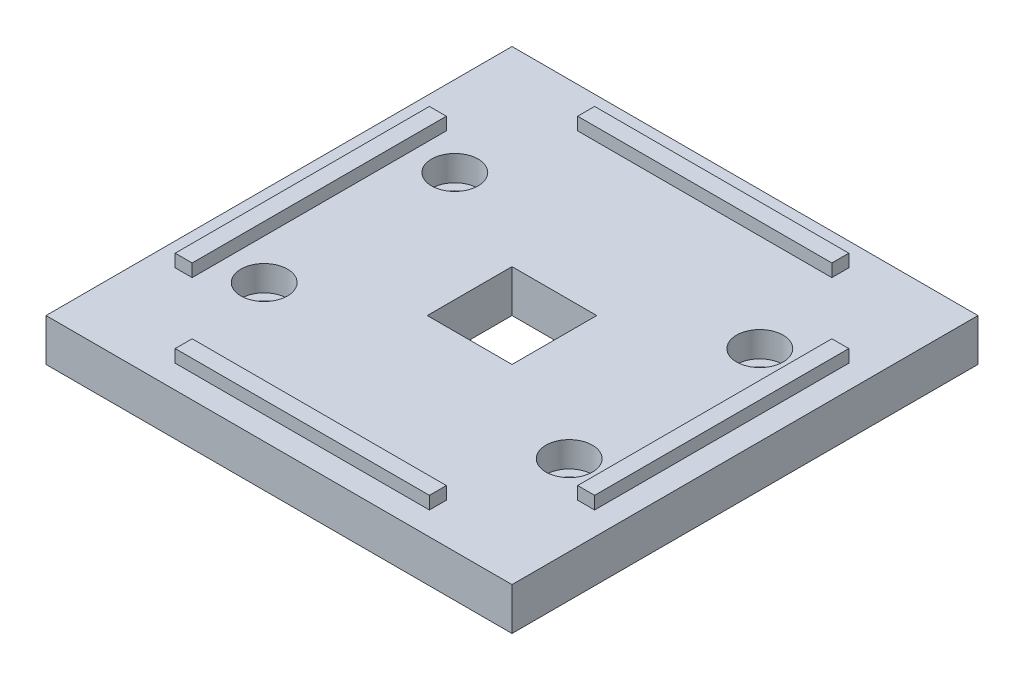
ISO-10303-21;
HEADER;
FILE_DESCRIPTION(('STEP AP214'),'2;1');
FILE_NAME('part.step','',(''),(''),'','','');
FILE_SCHEMA(('AUTOMOTIVE_DESIGN { 1 0 10303 214 1 1 1 1 }'));
ENDSEC;
DATA;
#1=APPLICATION_CONTEXT('core data for automotive mechanical design processes');
#2=APPLICATION_PROTOCOL_DEFINITION('international standard','automotive_design',2000,#1);
#3=PRODUCT_CONTEXT('',#1,'mechanical');
#4=PRODUCT('Part','Part','',(#3));
#5=PRODUCT_RELATED_PRODUCT_CATEGORY('part','',(#4));
#6=PRODUCT_DEFINITION_FORMATION('','',#4);
#7=PRODUCT_DEFINITION_CONTEXT('part definition',#1,'design');
#8=PRODUCT_DEFINITION('design','',#6,#7);
#9=PRODUCT_DEFINITION_SHAPE('','',#8);
#10=(LENGTH_UNIT() NAMED_UNIT(*) SI_UNIT(.MILLI.,.METRE.));
#11=(NAMED_UNIT(*) PLANE_ANGLE_UNIT() SI_UNIT($,.RADIAN.));
#12=(NAMED_UNIT(*) SI_UNIT($,.STERADIAN.) SOLID_ANGLE_UNIT());
#13=UNCERTAINTY_MEASURE_WITH_UNIT(LENGTH_MEASURE(1.E-05),#10,'distance_accuracy_value','');
#14=(GEOMETRIC_REPRESENTATION_CONTEXT(3) GLOBAL_UNCERTAINTY_ASSIGNED_CONTEXT((#13)) GLOBAL_UNIT_ASSIGNED_CONTEXT((#10,
#11,#12)) REPRESENTATION_CONTEXT('',''));
#15=CARTESIAN_POINT('',(0.,0.,0.));
#16=DIRECTION('',(0.,0.,1.));
#17=DIRECTION('',(1.,0.,0.));
#18=AXIS2_PLACEMENT_3D('',#15,#16,#17);
#19=CARTESIAN_POINT('',(9.5,0.,-38.75));
#20=DIRECTION('',(0.,1.,0.));
#21=DIRECTION('',(0.,0.,1.));
#22=AXIS2_PLACEMENT_3D('',#19,#20,#21);
#23=CYLINDRICAL_SURFACE('',#22,1.6);
#24=CARTESIAN_POINT('',(9.5,0.,-38.75));
#25=DIRECTION('',(0.,1.,0.));
#26=DIRECTION('',(0.,0.,1.));
#27=AXIS2_PLACEMENT_3D('',#24,#25,#26);
#28=CIRCLE('',#27,1.6);
#29=CARTESIAN_POINT('',(9.5,0.,-37.15));
#30=VERTEX_POINT('',#29);
#31=EDGE_CURVE('E230',#30,#30,#28,.T.);
#32=ORIENTED_EDGE('',*,*,#31,.F.);
#33=EDGE_LOOP('',(#32));
#34=FACE_BOUND('',#33,.T.);
#35=CARTESIAN_POINT('',(9.5,2.,-38.75));
#36=DIRECTION('',(0.,1.,0.));
#37=DIRECTION('',(0.,0.,1.));
#38=AXIS2_PLACEMENT_3D('',#35,#36,#37);
#39=CIRCLE('',#38,1.6);
#40=CARTESIAN_POINT('',(9.5,2.,-37.15));
#41=VERTEX_POINT('',#40);
#42=EDGE_CURVE('E37',#41,#41,#39,.F.);
#43=ORIENTED_EDGE('',*,*,#42,.F.);
#44=EDGE_LOOP('',(#43));
#45=FACE_BOUND('',#44,.T.);
#46=ADVANCED_FACE('F33',(#34,#45),#23,.F.);
#47=CARTESIAN_POINT('',(45.5,0.,-16.25));
#48=DIRECTION('',(0.,1.,0.));
#49=DIRECTION('',(0.,0.,1.));
#50=AXIS2_PLACEMENT_3D('',#47,#48,#49);
#51=CYLINDRICAL_SURFACE('',#50,1.6);
#52=CARTESIAN_POINT('',(45.5,0.,-16.25));
#53=DIRECTION('',(0.,1.,0.));
#54=DIRECTION('',(0.,0.,-1.));
#55=AXIS2_PLACEMENT_3D('',#52,#53,#54);
#56=CIRCLE('',#55,1.6);
#57=CARTESIAN_POINT('',(45.5,0.,-17.85));
#58=VERTEX_POINT('',#57);
#59=EDGE_CURVE('E221',#58,#58,#56,.T.);
#60=ORIENTED_EDGE('',*,*,#59,.F.);
#61=EDGE_LOOP('',(#60));
#62=FACE_BOUND('',#61,.T.);
#63=CARTESIAN_POINT('',(45.5,2.,-16.25));
#64=DIRECTION('',(0.,1.,0.));
#65=DIRECTION('',(0.,0.,1.));
#66=AXIS2_PLACEMENT_3D('',#63,#64,#65);
#67=CIRCLE('',#66,1.6);
#68=CARTESIAN_POINT('',(45.5,2.,-14.65));
#69=VERTEX_POINT('',#68);
#70=EDGE_CURVE('E403',#69,#69,#67,.F.);
#71=ORIENTED_EDGE('',*,*,#70,.F.);
#72=EDGE_LOOP('',(#71));
#73=FACE_BOUND('',#72,.T.);
#74=ADVANCED_FACE('F466',(#62,#73),#51,.F.);
#75=CARTESIAN_POINT('',(45.5,0.,-38.75));
#76=DIRECTION('',(0.,1.,0.));
#77=DIRECTION('',(0.,0.,1.));
#78=AXIS2_PLACEMENT_3D('',#75,#76,#77);
#79=CYLINDRICAL_SURFACE('',#78,1.6);
#80=CARTESIAN_POINT('',(45.5,0.,-38.75));
#81=DIRECTION('',(0.,1.,0.));
#82=DIRECTION('',(0.,0.,-1.));
#83=AXIS2_PLACEMENT_3D('',#80,#81,#82);
#84=CIRCLE('',#83,1.6);
#85=CARTESIAN_POINT('',(45.5,0.,-40.35));
#86=VERTEX_POINT('',#85);
#87=EDGE_CURVE('E226',#86,#86,#84,.T.);
#88=ORIENTED_EDGE('',*,*,#87,.F.);
#89=EDGE_LOOP('',(#88));
#90=FACE_BOUND('',#89,.T.);
#91=CARTESIAN_POINT('',(45.5,2.,-38.75));
#92=DIRECTION('',(0.,1.,0.));
#93=DIRECTION('',(0.,0.,1.));
#94=AXIS2_PLACEMENT_3D('',#91,#92,#93);
#95=CIRCLE('',#94,1.6);
#96=CARTESIAN_POINT('',(45.5,2.,-37.15));
#97=VERTEX_POINT('',#96);
#98=EDGE_CURVE('E400',#97,#97,#95,.F.);
#99=ORIENTED_EDGE('',*,*,#98,.F.);
#100=EDGE_LOOP('',(#99));
#101=FACE_BOUND('',#100,.T.);
#102=ADVANCED_FACE('F472',(#90,#101),#79,.F.);
#103=CARTESIAN_POINT('',(9.5,0.,-16.25));
#104=DIRECTION('',(0.,1.,0.));
#105=DIRECTION('',(0.,0.,1.));
#106=AXIS2_PLACEMENT_3D('',#103,#104,#105);
#107=CYLINDRICAL_SURFACE('',#106,1.6);
#108=CARTESIAN_POINT('',(9.5,0.,-16.25));
#109=DIRECTION('',(0.,1.,0.));
#110=DIRECTION('',(0.,0.,1.));
#111=AXIS2_PLACEMENT_3D('',#108,#109,#110);
#112=CIRCLE('',#111,1.6);
#113=CARTESIAN_POINT('',(9.5,0.,-14.65));
#114=VERTEX_POINT('',#113);
#115=EDGE_CURVE('E227',#114,#114,#112,.T.);
#116=ORIENTED_EDGE('',*,*,#115,.F.);
#117=EDGE_LOOP('',(#116));
#118=FACE_BOUND('',#117,.T.);
#119=CARTESIAN_POINT('',(9.5,2.,-16.25));
#120=DIRECTION('',(0.,1.,0.));
#121=DIRECTION('',(0.,0.,1.));
#122=AXIS2_PLACEMENT_3D('',#119,#120,#121);
#123=CIRCLE('',#122,1.6);
#124=CARTESIAN_POINT('',(9.5,2.,-14.65));
#125=VERTEX_POINT('',#124);
#126=EDGE_CURVE('E397',#125,#125,#123,.F.);
#127=ORIENTED_EDGE('',*,*,#126,.F.);
#128=EDGE_LOOP('',(#127));
#129=FACE_BOUND('',#128,.T.);
#130=ADVANCED_FACE('F447',(#118,#129),#107,.F.);
#131=CARTESIAN_POINT('',(0.,5.,0.));
#132=DIRECTION('',(0.,-1.,0.));
#133=DIRECTION('',(0.,0.,-1.));
#134=AXIS2_PLACEMENT_3D('',#131,#132,#133);
#135=PLANE('',#134);
#136=CARTESIAN_POINT('',(9.5,5.,-16.25));
#137=DIRECTION('',(0.,1.,0.));
#138=DIRECTION('',(0.,0.,1.));
#139=AXIS2_PLACEMENT_3D('',#136,#137,#138);
#140=CIRCLE('',#139,2.75);
#141=CARTESIAN_POINT('',(9.5,5.,-13.5));
#142=VERTEX_POINT('',#141);
#143=EDGE_CURVE('E417',#142,#142,#140,.T.);
#144=ORIENTED_EDGE('',*,*,#143,.F.);
#145=EDGE_LOOP('',(#144));
#146=FACE_BOUND('',#145,.T.);
#147=CARTESIAN_POINT('',(45.5,5.,-16.25));
#148=DIRECTION('',(0.,1.,0.));
#149=DIRECTION('',(0.,0.,1.));
#150=AXIS2_PLACEMENT_3D('',#147,#148,#149);
#151=CIRCLE('',#150,2.75);
#152=CARTESIAN_POINT('',(45.5,5.,-13.5));
#153=VERTEX_POINT('',#152);
#154=EDGE_CURVE('E423',#153,#153,#151,.T.);
#155=ORIENTED_EDGE('',*,*,#154,.F.);
#156=EDGE_LOOP('',(#155));
#157=FACE_BOUND('',#156,.T.);
#158=CARTESIAN_POINT('',(45.5,5.,-38.75));
#159=DIRECTION('',(0.,1.,0.));
#160=DIRECTION('',(0.,0.,1.));
#161=AXIS2_PLACEMENT_3D('',#158,#159,#160);
#162=CIRCLE('',#161,2.75);
#163=CARTESIAN_POINT('',(45.5,5.,-36.));
#164=VERTEX_POINT('',#163);
#165=EDGE_CURVE('E429',#164,#164,#162,.T.);
#166=ORIENTED_EDGE('',*,*,#165,.F.);
#167=EDGE_LOOP('',(#166));
#168=FACE_BOUND('',#167,.T.);
#169=CARTESIAN_POINT('',(9.5,5.,-38.75));
#170=DIRECTION('',(0.,1.,0.));
#171=DIRECTION('',(0.,0.,1.));
#172=AXIS2_PLACEMENT_3D('',#169,#170,#171);
#173=CIRCLE('',#172,2.75);
#174=CARTESIAN_POINT('',(9.5,5.,-36.));
#175=VERTEX_POINT('',#174);
#176=EDGE_CURVE('E411',#175,#175,#173,.T.);
#177=ORIENTED_EDGE('',*,*,#176,.F.);
#178=EDGE_LOOP('',(#177));
#179=FACE_BOUND('',#178,.T.);
#180=DIRECTION('',(1.,0.,0.));
#181=VECTOR('',#180,1.);
#182=CARTESIAN_POINT('',(22.5,5.,-22.5));
#183=LINE('',#182,#181);
#184=CARTESIAN_POINT('',(22.5,5.,-22.5));
#185=VERTEX_POINT('',#184);
#186=CARTESIAN_POINT('',(32.5,5.,-22.5));
#187=VERTEX_POINT('',#186);
#188=EDGE_CURVE('E207',#185,#187,#183,.T.);
#189=ORIENTED_EDGE('',*,*,#188,.F.);
#190=DIRECTION('',(0.,0.,1.));
#191=VECTOR('',#190,1.);
#192=CARTESIAN_POINT('',(22.5,5.,-22.5));
#193=LINE('',#192,#191);
#194=CARTESIAN_POINT('',(22.5,5.,-32.5));
#195=VERTEX_POINT('',#194);
#196=EDGE_CURVE('E50',#195,#185,#193,.T.);
#197=ORIENTED_EDGE('',*,*,#196,.F.);
#198=DIRECTION('',(-1.,0.,0.));
#199=VECTOR('',#198,1.);
#200=CARTESIAN_POINT('',(22.5,5.,-32.5));
#201=LINE('',#200,#199);
#202=CARTESIAN_POINT('',(32.5,5.,-32.5));
#203=VERTEX_POINT('',#202);
#204=EDGE_CURVE('E214',#203,#195,#201,.T.);
#205=ORIENTED_EDGE('',*,*,#204,.F.);
#206=DIRECTION('',(0.,0.,-1.));
#207=VECTOR('',#206,1.);
#208=CARTESIAN_POINT('',(32.5,5.,-22.5));
#209=LINE('',#208,#207);
#210=EDGE_CURVE('E198',#187,#203,#209,.T.);
#211=ORIENTED_EDGE('',*,*,#210,.F.);
#212=EDGE_LOOP('',(#189,#197,#205,#211));
#213=FACE_BOUND('',#212,.T.);
#214=DIRECTION('',(-1.,0.,0.));
#215=VECTOR('',#214,1.);
#216=CARTESIAN_POINT('',(52.25,5.,-42.5));
#217=LINE('',#216,#215);
#218=CARTESIAN_POINT('',(52.25,5.,-42.5));
#219=VERTEX_POINT('',#218);
#220=CARTESIAN_POINT('',(50.25,5.,-42.5));
#221=VERTEX_POINT('',#220);
#222=EDGE_CURVE('E287',#219,#221,#217,.T.);
#223=ORIENTED_EDGE('',*,*,#222,.F.);
#224=DIRECTION('',(0.,0.,1.));
#225=VECTOR('',#224,1.);
#226=CARTESIAN_POINT('',(52.25,5.,-42.5));
#227=LINE('',#226,#225);
#228=CARTESIAN_POINT('',(52.25,5.,-12.5));
#229=VERTEX_POINT('',#228);
#230=EDGE_CURVE('E277',#219,#229,#227,.T.);
#231=ORIENTED_EDGE('',*,*,#230,.T.);
#232=DIRECTION('',(-1.,0.,0.));
#233=VECTOR('',#232,1.);
#234=CARTESIAN_POINT('',(52.25,5.,-12.5));
#235=LINE('',#234,#233);
#236=CARTESIAN_POINT('',(50.25,5.,-12.5));
#237=VERTEX_POINT('',#236);
#238=EDGE_CURVE('E280',#229,#237,#235,.T.);
#239=ORIENTED_EDGE('',*,*,#238,.T.);
#240=DIRECTION('',(0.,0.,1.));
#241=VECTOR('',#240,1.);
#242=CARTESIAN_POINT('',(50.25,5.,-42.5));
#243=LINE('',#242,#241);
#244=EDGE_CURVE('E284',#221,#237,#243,.T.);
#245=ORIENTED_EDGE('',*,*,#244,.F.);
#246=EDGE_LOOP('',(#223,#231,#239,#245));
#247=FACE_BOUND('',#246,.T.);
#248=DIRECTION('',(0.,0.,1.));
#249=VECTOR('',#248,1.);
#250=CARTESIAN_POINT('',(0.,5.,0.));
#251=LINE('',#250,#249);
#252=CARTESIAN_POINT('',(0.,5.,-55.));
#253=VERTEX_POINT('',#252);
#254=CARTESIAN_POINT('',(0.,5.,0.));
#255=VERTEX_POINT('',#254);
#256=EDGE_CURVE('E364',#253,#255,#251,.T.);
#257=ORIENTED_EDGE('',*,*,#256,.T.);
#258=DIRECTION('',(1.,0.,0.));
#259=VECTOR('',#258,1.);
#260=CARTESIAN_POINT('',(0.,5.,0.));
#261=LINE('',#260,#259);
#262=CARTESIAN_POINT('',(55.,5.,0.));
#263=VERTEX_POINT('',#262);
#264=EDGE_CURVE('E367',#255,#263,#261,.T.);
#265=ORIENTED_EDGE('',*,*,#264,.T.);
#266=DIRECTION('',(0.,0.,-1.));
#267=VECTOR('',#266,1.);
#268=CARTESIAN_POINT('',(55.,5.,0.));
#269=LINE('',#268,#267);
#270=CARTESIAN_POINT('',(55.,5.,-55.));
#271=VERTEX_POINT('',#270);
#272=EDGE_CURVE('E370',#263,#271,#269,.T.);
#273=ORIENTED_EDGE('',*,*,#272,.T.);
#274=DIRECTION('',(-1.,0.,0.));
#275=VECTOR('',#274,1.);
#276=CARTESIAN_POINT('',(0.,5.,-55.));
#277=LINE('',#276,#275);
#278=EDGE_CURVE('E372',#271,#253,#277,.T.);
#279=ORIENTED_EDGE('',*,*,#278,.T.);
#280=EDGE_LOOP('',(#257,#265,#273,#279));
#281=FACE_BOUND('',#280,.T.);
#282=DIRECTION('',(0.,0.,-1.));
#283=VECTOR('',#282,1.);
#284=CARTESIAN_POINT('',(2.75,5.,-12.5));
#285=LINE('',#284,#283);
#286=CARTESIAN_POINT('',(2.75,5.,-12.5));
#287=VERTEX_POINT('',#286);
#288=CARTESIAN_POINT('',(2.75,5.,-42.5));
#289=VERTEX_POINT('',#288);
#290=EDGE_CURVE('E336',#287,#289,#285,.T.);
#291=ORIENTED_EDGE('',*,*,#290,.T.);
#292=DIRECTION('',(1.,0.,0.));
#293=VECTOR('',#292,1.);
#294=CARTESIAN_POINT('',(2.75,5.,-42.5));
#295=LINE('',#294,#293);
#296=CARTESIAN_POINT('',(4.75,5.,-42.5));
#297=VERTEX_POINT('',#296);
#298=EDGE_CURVE('E322',#289,#297,#295,.T.);
#299=ORIENTED_EDGE('',*,*,#298,.T.);
#300=DIRECTION('',(0.,0.,-1.));
#301=VECTOR('',#300,1.);
#302=CARTESIAN_POINT('',(4.75,5.,-12.5));
#303=LINE('',#302,#301);
#304=CARTESIAN_POINT('',(4.75,5.,-12.5));
#305=VERTEX_POINT('',#304);
#306=EDGE_CURVE('E345',#305,#297,#303,.T.);
#307=ORIENTED_EDGE('',*,*,#306,.F.);
#308=DIRECTION('',(1.,0.,0.));
#309=VECTOR('',#308,1.);
#310=CARTESIAN_POINT('',(2.75,5.,-12.5));
#311=LINE('',#310,#309);
#312=EDGE_CURVE('E348',#287,#305,#311,.T.);
#313=ORIENTED_EDGE('',*,*,#312,.F.);
#314=EDGE_LOOP('',(#291,#299,#307,#313));
#315=FACE_BOUND('',#314,.T.);
#316=DIRECTION('',(0.,0.,-1.));
#317=VECTOR('',#316,1.);
#318=CARTESIAN_POINT('',(42.5,5.,-2.75000000000001));
#319=LINE('',#318,#317);
#320=CARTESIAN_POINT('',(42.5,5.,-2.75000000000001));
#321=VERTEX_POINT('',#320);
#322=CARTESIAN_POINT('',(42.5,5.,-4.75000000000001));
#323=VERTEX_POINT('',#322);
#324=EDGE_CURVE('E319',#321,#323,#319,.T.);
#325=ORIENTED_EDGE('',*,*,#324,.F.);
#326=DIRECTION('',(-1.,0.,0.));
#327=VECTOR('',#326,1.);
#328=CARTESIAN_POINT('',(42.5,5.,-2.75000000000001));
#329=LINE('',#328,#327);
#330=CARTESIAN_POINT('',(12.5,5.,-2.75));
#331=VERTEX_POINT('',#330);
#332=EDGE_CURVE('E309',#321,#331,#329,.T.);
#333=ORIENTED_EDGE('',*,*,#332,.T.);
#334=DIRECTION('',(0.,0.,-1.));
#335=VECTOR('',#334,1.);
#336=CARTESIAN_POINT('',(12.5,5.,-2.75));
#337=LINE('',#336,#335);
#338=CARTESIAN_POINT('',(12.5,5.,-4.75));
#339=VERTEX_POINT('',#338);
#340=EDGE_CURVE('E312',#331,#339,#337,.T.);
#341=ORIENTED_EDGE('',*,*,#340,.T.);
#342=DIRECTION('',(-1.,0.,0.));
#343=VECTOR('',#342,1.);
#344=CARTESIAN_POINT('',(42.5,5.,-4.75000000000001));
#345=LINE('',#344,#343);
#346=EDGE_CURVE('E316',#323,#339,#345,.T.);
#347=ORIENTED_EDGE('',*,*,#346,.F.);
#348=EDGE_LOOP('',(#325,#333,#341,#347));
#349=FACE_BOUND('',#348,.T.);
#350=DIRECTION('',(0.,0.,1.));
#351=VECTOR('',#350,1.);
#352=CARTESIAN_POINT('',(12.5,5.,-52.25));
#353=LINE('',#352,#351);
#354=CARTESIAN_POINT('',(12.5,5.,-52.25));
#355=VERTEX_POINT('',#354);
#356=CARTESIAN_POINT('',(12.5,5.,-50.25));
#357=VERTEX_POINT('',#356);
#358=EDGE_CURVE('E255',#355,#357,#353,.T.);
#359=ORIENTED_EDGE('',*,*,#358,.F.);
#360=DIRECTION('',(1.,0.,0.));
#361=VECTOR('',#360,1.);
#362=CARTESIAN_POINT('',(12.5,5.,-52.25));
#363=LINE('',#362,#361);
#364=CARTESIAN_POINT('',(42.5,5.,-52.25));
#365=VERTEX_POINT('',#364);
#366=EDGE_CURVE('E245',#355,#365,#363,.T.);
#367=ORIENTED_EDGE('',*,*,#366,.T.);
#368=DIRECTION('',(0.,0.,1.));
#369=VECTOR('',#368,1.);
#370=CARTESIAN_POINT('',(42.5,5.,-52.25));
#371=LINE('',#370,#369);
#372=CARTESIAN_POINT('',(42.5,5.,-50.25));
#373=VERTEX_POINT('',#372);
#374=EDGE_CURVE('E248',#365,#373,#371,.T.);
#375=ORIENTED_EDGE('',*,*,#374,.T.);
#376=DIRECTION('',(1.,0.,0.));
#377=VECTOR('',#376,1.);
#378=CARTESIAN_POINT('',(12.5,5.,-50.25));
#379=LINE('',#378,#377);
#380=EDGE_CURVE('E252',#357,#373,#379,.T.);
#381=ORIENTED_EDGE('',*,*,#380,.F.);
#382=EDGE_LOOP('',(#359,#367,#375,#381));
#383=FACE_BOUND('',#382,.T.);
#384=ADVANCED_FACE('F211',(#146,#157,#168,#179,#213,#247,#281,#315,#349,#383),#135,.F.);
#385=CARTESIAN_POINT('',(0.,5.,0.));
#386=DIRECTION('',(1.,0.,0.));
#387=DIRECTION('',(0.,0.,-1.));
#388=AXIS2_PLACEMENT_3D('',#385,#386,#387);
#389=PLANE('',#388);
#390=DIRECTION('',(0.,0.,1.));
#391=VECTOR('',#390,1.);
#392=CARTESIAN_POINT('',(0.,0.,0.));
#393=LINE('',#392,#391);
#394=CARTESIAN_POINT('',(0.,0.,-55.));
#395=VERTEX_POINT('',#394);
#396=CARTESIAN_POINT('',(0.,0.,0.));
#397=VERTEX_POINT('',#396);
#398=EDGE_CURVE('E355',#395,#397,#393,.T.);
#399=ORIENTED_EDGE('',*,*,#398,.T.);
#400=DIRECTION('',(0.,-1.,0.));
#401=VECTOR('',#400,1.);
#402=CARTESIAN_POINT('',(0.,5.,0.));
#403=LINE('',#402,#401);
#404=EDGE_CURVE('E390',#255,#397,#403,.T.);
#405=ORIENTED_EDGE('',*,*,#404,.F.);
#406=ORIENTED_EDGE('',*,*,#256,.F.);
#407=DIRECTION('',(0.,-1.,0.));
#408=VECTOR('',#407,1.);
#409=CARTESIAN_POINT('',(0.,5.,-55.));
#410=LINE('',#409,#408);
#411=EDGE_CURVE('E374',#253,#395,#410,.T.);
#412=ORIENTED_EDGE('',*,*,#411,.T.);
#413=EDGE_LOOP('',(#399,#405,#406,#412));
#414=FACE_BOUND('',#413,.T.);
#415=ADVANCED_FACE('F35',(#414),#389,.F.);
#416=CARTESIAN_POINT('',(0.,5.,0.));
#417=DIRECTION('',(0.,0.,-1.));
#418=DIRECTION('',(-1.,0.,0.));
#419=AXIS2_PLACEMENT_3D('',#416,#417,#418);
#420=PLANE('',#419);
#421=DIRECTION('',(1.,0.,0.));
#422=VECTOR('',#421,1.);
#423=CARTESIAN_POINT('',(0.,0.,0.));
#424=LINE('',#423,#422);
#425=CARTESIAN_POINT('',(55.,0.,0.));
#426=VERTEX_POINT('',#425);
#427=EDGE_CURVE('E377',#397,#426,#424,.T.);
#428=ORIENTED_EDGE('',*,*,#427,.T.);
#429=DIRECTION('',(0.,-1.,0.));
#430=VECTOR('',#429,1.);
#431=CARTESIAN_POINT('',(55.,5.,0.));
#432=LINE('',#431,#430);
#433=EDGE_CURVE('E387',#263,#426,#432,.T.);
#434=ORIENTED_EDGE('',*,*,#433,.F.);
#435=ORIENTED_EDGE('',*,*,#264,.F.);
#436=ORIENTED_EDGE('',*,*,#404,.T.);
#437=EDGE_LOOP('',(#428,#434,#435,#436));
#438=FACE_BOUND('',#437,.T.);
#439=ADVANCED_FACE('F571',(#438),#420,.F.);
#440=CARTESIAN_POINT('',(55.,5.,0.));
#441=DIRECTION('',(-1.,0.,0.));
#442=DIRECTION('',(0.,0.,1.));
#443=AXIS2_PLACEMENT_3D('',#440,#441,#442);
#444=PLANE('',#443);
#445=DIRECTION('',(0.,0.,-1.));
#446=VECTOR('',#445,1.);
#447=CARTESIAN_POINT('',(55.,0.,0.));
#448=LINE('',#447,#446);
#449=CARTESIAN_POINT('',(55.,0.,-55.));
#450=VERTEX_POINT('',#449);
#451=EDGE_CURVE('E379',#426,#450,#448,.T.);
#452=ORIENTED_EDGE('',*,*,#451,.T.);
#453=DIRECTION('',(0.,-1.,0.));
#454=VECTOR('',#453,1.);
#455=CARTESIAN_POINT('',(55.,5.,-55.));
#456=LINE('',#455,#454);
#457=EDGE_CURVE('E384',#271,#450,#456,.T.);
#458=ORIENTED_EDGE('',*,*,#457,.F.);
#459=ORIENTED_EDGE('',*,*,#272,.F.);
#460=ORIENTED_EDGE('',*,*,#433,.T.);
#461=EDGE_LOOP('',(#452,#458,#459,#460));
#462=FACE_BOUND('',#461,.T.);
#463=ADVANCED_FACE('F568',(#462),#444,.F.);
#464=CARTESIAN_POINT('',(0.,5.,-55.));
#465=DIRECTION('',(0.,0.,1.));
#466=DIRECTION('',(1.,0.,0.));
#467=AXIS2_PLACEMENT_3D('',#464,#465,#466);
#468=PLANE('',#467);
#469=DIRECTION('',(-1.,0.,0.));
#470=VECTOR('',#469,1.);
#471=CARTESIAN_POINT('',(0.,0.,-55.));
#472=LINE('',#471,#470);
#473=EDGE_CURVE('E368',#450,#395,#472,.T.);
#474=ORIENTED_EDGE('',*,*,#473,.T.);
#475=ORIENTED_EDGE('',*,*,#411,.F.);
#476=ORIENTED_EDGE('',*,*,#278,.F.);
#477=ORIENTED_EDGE('',*,*,#457,.T.);
#478=EDGE_LOOP('',(#474,#475,#476,#477));
#479=FACE_BOUND('',#478,.T.);
#480=ADVANCED_FACE('F564',(#479),#468,.F.);
#481=CARTESIAN_POINT('',(0.,0.,0.));
#482=DIRECTION('',(0.,-1.,0.));
#483=DIRECTION('',(0.,0.,-1.));
#484=AXIS2_PLACEMENT_3D('',#481,#482,#483);
#485=PLANE('',#484);
#486=DIRECTION('',(0.,0.,-1.));
#487=VECTOR('',#486,1.);
#488=CARTESIAN_POINT('',(22.5,0.,0.));
#489=LINE('',#488,#487);
#490=CARTESIAN_POINT('',(22.5,0.,-22.5));
#491=VERTEX_POINT('',#490);
#492=CARTESIAN_POINT('',(22.5,0.,-32.5));
#493=VERTEX_POINT('',#492);
#494=EDGE_CURVE('E11',#491,#493,#489,.T.);
#495=ORIENTED_EDGE('',*,*,#494,.F.);
#496=DIRECTION('',(-1.,0.,0.));
#497=VECTOR('',#496,1.);
#498=CARTESIAN_POINT('',(0.,0.,-22.5));
#499=LINE('',#498,#497);
#500=CARTESIAN_POINT('',(32.5,0.,-22.5));
#501=VERTEX_POINT('',#500);
#502=EDGE_CURVE('E393',#501,#491,#499,.T.);
#503=ORIENTED_EDGE('',*,*,#502,.F.);
#504=DIRECTION('',(0.,0.,1.));
#505=VECTOR('',#504,1.);
#506=CARTESIAN_POINT('',(32.5,0.,0.));
#507=LINE('',#506,#505);
#508=CARTESIAN_POINT('',(32.5,0.,-32.5));
#509=VERTEX_POINT('',#508);
#510=EDGE_CURVE('E201',#509,#501,#507,.T.);
#511=ORIENTED_EDGE('',*,*,#510,.F.);
#512=DIRECTION('',(1.,0.,0.));
#513=VECTOR('',#512,1.);
#514=CARTESIAN_POINT('',(0.,0.,-32.5));
#515=LINE('',#514,#513);
#516=EDGE_CURVE('E42',#493,#509,#515,.T.);
#517=ORIENTED_EDGE('',*,*,#516,.F.);
#518=EDGE_LOOP('',(#495,#503,#511,#517));
#519=FACE_BOUND('',#518,.T.);
#520=ORIENTED_EDGE('',*,*,#115,.T.);
#521=EDGE_LOOP('',(#520));
#522=FACE_BOUND('',#521,.T.);
#523=ORIENTED_EDGE('',*,*,#87,.T.);
#524=EDGE_LOOP('',(#523));
#525=FACE_BOUND('',#524,.T.);
#526=ORIENTED_EDGE('',*,*,#59,.T.);
#527=EDGE_LOOP('',(#526));
#528=FACE_BOUND('',#527,.T.);
#529=ORIENTED_EDGE('',*,*,#31,.T.);
#530=EDGE_LOOP('',(#529));
#531=FACE_BOUND('',#530,.T.);
#532=ORIENTED_EDGE('',*,*,#398,.F.);
#533=ORIENTED_EDGE('',*,*,#473,.F.);
#534=ORIENTED_EDGE('',*,*,#451,.F.);
#535=ORIENTED_EDGE('',*,*,#427,.F.);
#536=EDGE_LOOP('',(#532,#533,#534,#535));
#537=FACE_BOUND('',#536,.T.);
#538=ADVANCED_FACE('F559',(#519,#522,#525,#528,#531,#537),#485,.T.);
#539=CARTESIAN_POINT('',(2.75,6.5,-42.5));
#540=DIRECTION('',(0.,0.,-1.));
#541=DIRECTION('',(-1.,0.,0.));
#542=AXIS2_PLACEMENT_3D('',#539,#540,#541);
#543=PLANE('',#542);
#544=ORIENTED_EDGE('',*,*,#298,.F.);
#545=DIRECTION('',(0.,-1.,0.));
#546=VECTOR('',#545,1.);
#547=CARTESIAN_POINT('',(2.75,6.5,-42.5));
#548=LINE('',#547,#546);
#549=CARTESIAN_POINT('',(2.75,6.5,-42.5));
#550=VERTEX_POINT('',#549);
#551=EDGE_CURVE('E352',#550,#289,#548,.T.);
#552=ORIENTED_EDGE('',*,*,#551,.F.);
#553=DIRECTION('',(1.,0.,0.));
#554=VECTOR('',#553,1.);
#555=CARTESIAN_POINT('',(2.75,6.5,-42.5));
#556=LINE('',#555,#554);
#557=CARTESIAN_POINT('',(4.75,6.5,-42.5));
#558=VERTEX_POINT('',#557);
#559=EDGE_CURVE('E332',#550,#558,#556,.T.);
#560=ORIENTED_EDGE('',*,*,#559,.T.);
#561=DIRECTION('',(0.,-1.,0.));
#562=VECTOR('',#561,1.);
#563=CARTESIAN_POINT('',(4.75,6.5,-42.5));
#564=LINE('',#563,#562);
#565=EDGE_CURVE('E343',#558,#297,#564,.T.);
#566=ORIENTED_EDGE('',*,*,#565,.T.);
#567=EDGE_LOOP('',(#544,#552,#560,#566));
#568=FACE_BOUND('',#567,.T.);
#569=ADVANCED_FACE('F550',(#568),#543,.T.);
#570=CARTESIAN_POINT('',(2.75,6.5,-12.5));
#571=DIRECTION('',(-1.,0.,0.));
#572=DIRECTION('',(0.,0.,1.));
#573=AXIS2_PLACEMENT_3D('',#570,#571,#572);
#574=PLANE('',#573);
#575=ORIENTED_EDGE('',*,*,#290,.F.);
#576=DIRECTION('',(0.,-1.,0.));
#577=VECTOR('',#576,1.);
#578=CARTESIAN_POINT('',(2.75,6.5,-12.5));
#579=LINE('',#578,#577);
#580=CARTESIAN_POINT('',(2.75,6.5,-12.5));
#581=VERTEX_POINT('',#580);
#582=EDGE_CURVE('E356',#581,#287,#579,.T.);
#583=ORIENTED_EDGE('',*,*,#582,.F.);
#584=DIRECTION('',(0.,0.,-1.));
#585=VECTOR('',#584,1.);
#586=CARTESIAN_POINT('',(2.75,6.5,-12.5));
#587=LINE('',#586,#585);
#588=EDGE_CURVE('E340',#581,#550,#587,.T.);
#589=ORIENTED_EDGE('',*,*,#588,.T.);
#590=ORIENTED_EDGE('',*,*,#551,.T.);
#591=EDGE_LOOP('',(#575,#583,#589,#590));
#592=FACE_BOUND('',#591,.T.);
#593=ADVANCED_FACE('F546',(#592),#574,.T.);
#594=CARTESIAN_POINT('',(2.75,6.5,-12.5));
#595=DIRECTION('',(0.,0.,-1.));
#596=DIRECTION('',(-1.,0.,0.));
#597=AXIS2_PLACEMENT_3D('',#594,#595,#596);
#598=PLANE('',#597);
#599=ORIENTED_EDGE('',*,*,#312,.T.);
#600=DIRECTION('',(0.,-1.,0.));
#601=VECTOR('',#600,1.);
#602=CARTESIAN_POINT('',(4.75,6.5,-12.5));
#603=LINE('',#602,#601);
#604=CARTESIAN_POINT('',(4.75,6.5,-12.5));
#605=VERTEX_POINT('',#604);
#606=EDGE_CURVE('E359',#605,#305,#603,.T.);
#607=ORIENTED_EDGE('',*,*,#606,.F.);
#608=DIRECTION('',(1.,0.,0.));
#609=VECTOR('',#608,1.);
#610=CARTESIAN_POINT('',(2.75,6.5,-12.5));
#611=LINE('',#610,#609);
#612=EDGE_CURVE('E338',#581,#605,#611,.T.);
#613=ORIENTED_EDGE('',*,*,#612,.F.);
#614=ORIENTED_EDGE('',*,*,#582,.T.);
#615=EDGE_LOOP('',(#599,#607,#613,#614));
#616=FACE_BOUND('',#615,.T.);
#617=ADVANCED_FACE('F549',(#616),#598,.F.);
#618=CARTESIAN_POINT('',(4.75,6.5,-12.5));
#619=DIRECTION('',(-1.,0.,0.));
#620=DIRECTION('',(0.,0.,1.));
#621=AXIS2_PLACEMENT_3D('',#618,#619,#620);
#622=PLANE('',#621);
#623=ORIENTED_EDGE('',*,*,#306,.T.);
#624=ORIENTED_EDGE('',*,*,#565,.F.);
#625=DIRECTION('',(0.,0.,-1.));
#626=VECTOR('',#625,1.);
#627=CARTESIAN_POINT('',(4.75,6.5,-12.5));
#628=LINE('',#627,#626);
#629=EDGE_CURVE('E335',#605,#558,#628,.T.);
#630=ORIENTED_EDGE('',*,*,#629,.F.);
#631=ORIENTED_EDGE('',*,*,#606,.T.);
#632=EDGE_LOOP('',(#623,#624,#630,#631));
#633=FACE_BOUND('',#632,.T.);
#634=ADVANCED_FACE('F544',(#633),#622,.F.);
#635=CARTESIAN_POINT('',(0.,6.5,0.));
#636=DIRECTION('',(0.,1.,0.));
#637=DIRECTION('',(0.,0.,1.));
#638=AXIS2_PLACEMENT_3D('',#635,#636,#637);
#639=PLANE('',#638);
#640=ORIENTED_EDGE('',*,*,#559,.F.);
#641=ORIENTED_EDGE('',*,*,#588,.F.);
#642=ORIENTED_EDGE('',*,*,#612,.T.);
#643=ORIENTED_EDGE('',*,*,#629,.T.);
#644=EDGE_LOOP('',(#640,#641,#642,#643));
#645=FACE_BOUND('',#644,.T.);
#646=ADVANCED_FACE('F526',(#645),#639,.T.);
#647=CARTESIAN_POINT('',(42.5,6.5,-2.75000000000001));
#648=DIRECTION('',(-1.,0.,0.));
#649=DIRECTION('',(0.,0.,1.));
#650=AXIS2_PLACEMENT_3D('',#647,#648,#649);
#651=PLANE('',#650);
#652=ORIENTED_EDGE('',*,*,#324,.T.);
#653=DIRECTION('',(0.,-1.,0.));
#654=VECTOR('',#653,1.);
#655=CARTESIAN_POINT('',(42.5,6.5,-4.75000000000001));
#656=LINE('',#655,#654);
#657=CARTESIAN_POINT('',(42.5,6.5,-4.75000000000001));
#658=VERTEX_POINT('',#657);
#659=EDGE_CURVE('E290',#658,#323,#656,.T.);
#660=ORIENTED_EDGE('',*,*,#659,.F.);
#661=DIRECTION('',(0.,0.,-1.));
#662=VECTOR('',#661,1.);
#663=CARTESIAN_POINT('',(42.5,6.5,-2.75000000000001));
#664=LINE('',#663,#662);
#665=CARTESIAN_POINT('',(42.5,6.5,-2.75000000000001));
#666=VERTEX_POINT('',#665);
#667=EDGE_CURVE('E313',#666,#658,#664,.T.);
#668=ORIENTED_EDGE('',*,*,#667,.F.);
#669=DIRECTION('',(0.,-1.,0.));
#670=VECTOR('',#669,1.);
#671=CARTESIAN_POINT('',(42.5,6.5,-2.75000000000001));
#672=LINE('',#671,#670);
#673=EDGE_CURVE('E306',#666,#321,#672,.T.);
#674=ORIENTED_EDGE('',*,*,#673,.T.);
#675=EDGE_LOOP('',(#652,#660,#668,#674));
#676=FACE_BOUND('',#675,.T.);
#677=ADVANCED_FACE('F522',(#676),#651,.F.);
#678=CARTESIAN_POINT('',(42.5,6.5,-4.75000000000001));
#679=DIRECTION('',(0.,0.,1.));
#680=DIRECTION('',(1.,0.,0.));
#681=AXIS2_PLACEMENT_3D('',#678,#679,#680);
#682=PLANE('',#681);
#683=ORIENTED_EDGE('',*,*,#346,.T.);
#684=DIRECTION('',(0.,-1.,0.));
#685=VECTOR('',#684,1.);
#686=CARTESIAN_POINT('',(12.5,6.5,-4.75));
#687=LINE('',#686,#685);
#688=CARTESIAN_POINT('',(12.5,6.5,-4.75));
#689=VERTEX_POINT('',#688);
#690=EDGE_CURVE('E301',#689,#339,#687,.T.);
#691=ORIENTED_EDGE('',*,*,#690,.F.);
#692=DIRECTION('',(-1.,0.,0.));
#693=VECTOR('',#692,1.);
#694=CARTESIAN_POINT('',(42.5,6.5,-4.75000000000001));
#695=LINE('',#694,#693);
#696=EDGE_CURVE('E328',#658,#689,#695,.T.);
#697=ORIENTED_EDGE('',*,*,#696,.F.);
#698=ORIENTED_EDGE('',*,*,#659,.T.);
#699=EDGE_LOOP('',(#683,#691,#697,#698));
#700=FACE_BOUND('',#699,.T.);
#701=ADVANCED_FACE('F525',(#700),#682,.F.);
#702=CARTESIAN_POINT('',(12.5,6.5,-2.75));
#703=DIRECTION('',(-1.,0.,0.));
#704=DIRECTION('',(0.,0.,1.));
#705=AXIS2_PLACEMENT_3D('',#702,#703,#704);
#706=PLANE('',#705);
#707=ORIENTED_EDGE('',*,*,#340,.F.);
#708=DIRECTION('',(0.,-1.,0.));
#709=VECTOR('',#708,1.);
#710=CARTESIAN_POINT('',(12.5,6.5,-2.75));
#711=LINE('',#710,#709);
#712=CARTESIAN_POINT('',(12.5,6.5,-2.75));
#713=VERTEX_POINT('',#712);
#714=EDGE_CURVE('E303',#713,#331,#711,.T.);
#715=ORIENTED_EDGE('',*,*,#714,.F.);
#716=DIRECTION('',(0.,0.,-1.));
#717=VECTOR('',#716,1.);
#718=CARTESIAN_POINT('',(12.5,6.5,-2.75));
#719=LINE('',#718,#717);
#720=EDGE_CURVE('E325',#713,#689,#719,.T.);
#721=ORIENTED_EDGE('',*,*,#720,.T.);
#722=ORIENTED_EDGE('',*,*,#690,.T.);
#723=EDGE_LOOP('',(#707,#715,#721,#722));
#724=FACE_BOUND('',#723,.T.);
#725=ADVANCED_FACE('F530',(#724),#706,.T.);
#726=CARTESIAN_POINT('',(42.5,6.5,-2.75000000000001));
#727=DIRECTION('',(0.,0.,1.));
#728=DIRECTION('',(1.,0.,0.));
#729=AXIS2_PLACEMENT_3D('',#726,#727,#728);
#730=PLANE('',#729);
#731=ORIENTED_EDGE('',*,*,#332,.F.);
#732=ORIENTED_EDGE('',*,*,#673,.F.);
#733=DIRECTION('',(-1.,0.,0.));
#734=VECTOR('',#733,1.);
#735=CARTESIAN_POINT('',(42.5,6.5,-2.75000000000001));
#736=LINE('',#735,#734);
#737=EDGE_CURVE('E308',#666,#713,#736,.T.);
#738=ORIENTED_EDGE('',*,*,#737,.T.);
#739=ORIENTED_EDGE('',*,*,#714,.T.);
#740=EDGE_LOOP('',(#731,#732,#738,#739));
#741=FACE_BOUND('',#740,.T.);
#742=ADVANCED_FACE('F534',(#741),#730,.T.);
#743=CARTESIAN_POINT('',(0.,6.5,0.));
#744=DIRECTION('',(0.,1.,0.));
#745=DIRECTION('',(0.,0.,1.));
#746=AXIS2_PLACEMENT_3D('',#743,#744,#745);
#747=PLANE('',#746);
#748=ORIENTED_EDGE('',*,*,#667,.T.);
#749=ORIENTED_EDGE('',*,*,#696,.T.);
#750=ORIENTED_EDGE('',*,*,#720,.F.);
#751=ORIENTED_EDGE('',*,*,#737,.F.);
#752=EDGE_LOOP('',(#748,#749,#750,#751));
#753=FACE_BOUND('',#752,.T.);
#754=ADVANCED_FACE('F506',(#753),#747,.T.);
#755=CARTESIAN_POINT('',(52.25,6.5,-42.5));
#756=DIRECTION('',(0.,0.,1.));
#757=DIRECTION('',(1.,0.,0.));
#758=AXIS2_PLACEMENT_3D('',#755,#756,#757);
#759=PLANE('',#758);
#760=ORIENTED_EDGE('',*,*,#222,.T.);
#761=DIRECTION('',(0.,-1.,0.));
#762=VECTOR('',#761,1.);
#763=CARTESIAN_POINT('',(50.25,6.5,-42.5));
#764=LINE('',#763,#762);
#765=CARTESIAN_POINT('',(50.25,6.5,-42.5));
#766=VERTEX_POINT('',#765);
#767=EDGE_CURVE('E258',#766,#221,#764,.T.);
#768=ORIENTED_EDGE('',*,*,#767,.F.);
#769=DIRECTION('',(-1.,0.,0.));
#770=VECTOR('',#769,1.);
#771=CARTESIAN_POINT('',(52.25,6.5,-42.5));
#772=LINE('',#771,#770);
#773=CARTESIAN_POINT('',(52.25,6.5,-42.5));
#774=VERTEX_POINT('',#773);
#775=EDGE_CURVE('E281',#774,#766,#772,.T.);
#776=ORIENTED_EDGE('',*,*,#775,.F.);
#777=DIRECTION('',(0.,-1.,0.));
#778=VECTOR('',#777,1.);
#779=CARTESIAN_POINT('',(52.25,6.5,-42.5));
#780=LINE('',#779,#778);
#781=EDGE_CURVE('E274',#774,#219,#780,.T.);
#782=ORIENTED_EDGE('',*,*,#781,.T.);
#783=EDGE_LOOP('',(#760,#768,#776,#782));
#784=FACE_BOUND('',#783,.T.);
#785=ADVANCED_FACE('F502',(#784),#759,.F.);
#786=CARTESIAN_POINT('',(50.25,6.5,-42.5));
#787=DIRECTION('',(1.,0.,0.));
#788=DIRECTION('',(0.,0.,-1.));
#789=AXIS2_PLACEMENT_3D('',#786,#787,#788);
#790=PLANE('',#789);
#791=ORIENTED_EDGE('',*,*,#244,.T.);
#792=DIRECTION('',(0.,-1.,0.));
#793=VECTOR('',#792,1.);
#794=CARTESIAN_POINT('',(50.25,6.5,-12.5));
#795=LINE('',#794,#793);
#796=CARTESIAN_POINT('',(50.25,6.5,-12.5));
#797=VERTEX_POINT('',#796);
#798=EDGE_CURVE('E269',#797,#237,#795,.T.);
#799=ORIENTED_EDGE('',*,*,#798,.F.);
#800=DIRECTION('',(0.,0.,1.));
#801=VECTOR('',#800,1.);
#802=CARTESIAN_POINT('',(50.25,6.5,-42.5));
#803=LINE('',#802,#801);
#804=EDGE_CURVE('E296',#766,#797,#803,.T.);
#805=ORIENTED_EDGE('',*,*,#804,.F.);
#806=ORIENTED_EDGE('',*,*,#767,.T.);
#807=EDGE_LOOP('',(#791,#799,#805,#806));
#808=FACE_BOUND('',#807,.T.);
#809=ADVANCED_FACE('F505',(#808),#790,.F.);
#810=CARTESIAN_POINT('',(52.25,6.5,-12.5));
#811=DIRECTION('',(0.,0.,1.));
#812=DIRECTION('',(1.,0.,0.));
#813=AXIS2_PLACEMENT_3D('',#810,#811,#812);
#814=PLANE('',#813);
#815=ORIENTED_EDGE('',*,*,#238,.F.);
#816=DIRECTION('',(0.,-1.,0.));
#817=VECTOR('',#816,1.);
#818=CARTESIAN_POINT('',(52.25,6.5,-12.5));
#819=LINE('',#818,#817);
#820=CARTESIAN_POINT('',(52.25,6.5,-12.5));
#821=VERTEX_POINT('',#820);
#822=EDGE_CURVE('E271',#821,#229,#819,.T.);
#823=ORIENTED_EDGE('',*,*,#822,.F.);
#824=DIRECTION('',(-1.,0.,0.));
#825=VECTOR('',#824,1.);
#826=CARTESIAN_POINT('',(52.25,6.5,-12.5));
#827=LINE('',#826,#825);
#828=EDGE_CURVE('E293',#821,#797,#827,.T.);
#829=ORIENTED_EDGE('',*,*,#828,.T.);
#830=ORIENTED_EDGE('',*,*,#798,.T.);
#831=EDGE_LOOP('',(#815,#823,#829,#830));
#832=FACE_BOUND('',#831,.T.);
#833=ADVANCED_FACE('F510',(#832),#814,.T.);
#834=CARTESIAN_POINT('',(52.25,6.5,-42.5));
#835=DIRECTION('',(1.,0.,0.));
#836=DIRECTION('',(0.,0.,-1.));
#837=AXIS2_PLACEMENT_3D('',#834,#835,#836);
#838=PLANE('',#837);
#839=ORIENTED_EDGE('',*,*,#230,.F.);
#840=ORIENTED_EDGE('',*,*,#781,.F.);
#841=DIRECTION('',(0.,0.,1.));
#842=VECTOR('',#841,1.);
#843=CARTESIAN_POINT('',(52.25,6.5,-42.5));
#844=LINE('',#843,#842);
#845=EDGE_CURVE('E276',#774,#821,#844,.T.);
#846=ORIENTED_EDGE('',*,*,#845,.T.);
#847=ORIENTED_EDGE('',*,*,#822,.T.);
#848=EDGE_LOOP('',(#839,#840,#846,#847));
#849=FACE_BOUND('',#848,.T.);
#850=ADVANCED_FACE('F514',(#849),#838,.T.);
#851=CARTESIAN_POINT('',(0.,6.5,0.));
#852=DIRECTION('',(0.,1.,0.));
#853=DIRECTION('',(0.,0.,1.));
#854=AXIS2_PLACEMENT_3D('',#851,#852,#853);
#855=PLANE('',#854);
#856=ORIENTED_EDGE('',*,*,#775,.T.);
#857=ORIENTED_EDGE('',*,*,#804,.T.);
#858=ORIENTED_EDGE('',*,*,#828,.F.);
#859=ORIENTED_EDGE('',*,*,#845,.F.);
#860=EDGE_LOOP('',(#856,#857,#858,#859));
#861=FACE_BOUND('',#860,.T.);
#862=ADVANCED_FACE('F484',(#861),#855,.T.);
#863=CARTESIAN_POINT('',(12.5,6.5,-52.25));
#864=DIRECTION('',(1.,0.,0.));
#865=DIRECTION('',(0.,0.,-1.));
#866=AXIS2_PLACEMENT_3D('',#863,#864,#865);
#867=PLANE('',#866);
#868=ORIENTED_EDGE('',*,*,#358,.T.);
#869=DIRECTION('',(0.,-1.,0.));
#870=VECTOR('',#869,1.);
#871=CARTESIAN_POINT('',(12.5,6.5,-50.25));
#872=LINE('',#871,#870);
#873=CARTESIAN_POINT('',(12.5,6.5,-50.25));
#874=VERTEX_POINT('',#873);
#875=EDGE_CURVE('E235',#874,#357,#872,.T.);
#876=ORIENTED_EDGE('',*,*,#875,.F.);
#877=DIRECTION('',(0.,0.,1.));
#878=VECTOR('',#877,1.);
#879=CARTESIAN_POINT('',(12.5,6.5,-52.25));
#880=LINE('',#879,#878);
#881=CARTESIAN_POINT('',(12.5,6.5,-52.25));
#882=VERTEX_POINT('',#881);
#883=EDGE_CURVE('E249',#882,#874,#880,.T.);
#884=ORIENTED_EDGE('',*,*,#883,.F.);
#885=DIRECTION('',(0.,-1.,0.));
#886=VECTOR('',#885,1.);
#887=CARTESIAN_POINT('',(12.5,6.5,-52.25));
#888=LINE('',#887,#886);
#889=EDGE_CURVE('E242',#882,#355,#888,.T.);
#890=ORIENTED_EDGE('',*,*,#889,.T.);
#891=EDGE_LOOP('',(#868,#876,#884,#890));
#892=FACE_BOUND('',#891,.T.);
#893=ADVANCED_FACE('F480',(#892),#867,.F.);
#894=CARTESIAN_POINT('',(12.5,6.5,-50.25));
#895=DIRECTION('',(0.,0.,-1.));
#896=DIRECTION('',(-1.,0.,0.));
#897=AXIS2_PLACEMENT_3D('',#894,#895,#896);
#898=PLANE('',#897);
#899=ORIENTED_EDGE('',*,*,#380,.T.);
#900=DIRECTION('',(0.,-1.,0.));
#901=VECTOR('',#900,1.);
#902=CARTESIAN_POINT('',(42.5,6.5,-50.25));
#903=LINE('',#902,#901);
#904=CARTESIAN_POINT('',(42.5,6.5,-50.25));
#905=VERTEX_POINT('',#904);
#906=EDGE_CURVE('E237',#905,#373,#903,.T.);
#907=ORIENTED_EDGE('',*,*,#906,.F.);
#908=DIRECTION('',(1.,0.,0.));
#909=VECTOR('',#908,1.);
#910=CARTESIAN_POINT('',(12.5,6.5,-50.25));
#911=LINE('',#910,#909);
#912=EDGE_CURVE('E264',#874,#905,#911,.T.);
#913=ORIENTED_EDGE('',*,*,#912,.F.);
#914=ORIENTED_EDGE('',*,*,#875,.T.);
#915=EDGE_LOOP('',(#899,#907,#913,#914));
#916=FACE_BOUND('',#915,.T.);
#917=ADVANCED_FACE('F483',(#916),#898,.F.);
#918=CARTESIAN_POINT('',(42.5,6.5,-52.25));
#919=DIRECTION('',(1.,0.,0.));
#920=DIRECTION('',(0.,0.,-1.));
#921=AXIS2_PLACEMENT_3D('',#918,#919,#920);
#922=PLANE('',#921);
#923=ORIENTED_EDGE('',*,*,#374,.F.);
#924=DIRECTION('',(0.,-1.,0.));
#925=VECTOR('',#924,1.);
#926=CARTESIAN_POINT('',(42.5,6.5,-52.25));
#927=LINE('',#926,#925);
#928=CARTESIAN_POINT('',(42.5,6.5,-52.25));
#929=VERTEX_POINT('',#928);
#930=EDGE_CURVE('E239',#929,#365,#927,.T.);
#931=ORIENTED_EDGE('',*,*,#930,.F.);
#932=DIRECTION('',(0.,0.,1.));
#933=VECTOR('',#932,1.);
#934=CARTESIAN_POINT('',(42.5,6.5,-52.25));
#935=LINE('',#934,#933);
#936=EDGE_CURVE('E261',#929,#905,#935,.T.);
#937=ORIENTED_EDGE('',*,*,#936,.T.);
#938=ORIENTED_EDGE('',*,*,#906,.T.);
#939=EDGE_LOOP('',(#923,#931,#937,#938));
#940=FACE_BOUND('',#939,.T.);
#941=ADVANCED_FACE('F488',(#940),#922,.T.);
#942=CARTESIAN_POINT('',(12.5,6.5,-52.25));
#943=DIRECTION('',(0.,0.,-1.));
#944=DIRECTION('',(-1.,0.,0.));
#945=AXIS2_PLACEMENT_3D('',#942,#943,#944);
#946=PLANE('',#945);
#947=ORIENTED_EDGE('',*,*,#366,.F.);
#948=ORIENTED_EDGE('',*,*,#889,.F.);
#949=DIRECTION('',(1.,0.,0.));
#950=VECTOR('',#949,1.);
#951=CARTESIAN_POINT('',(12.5,6.5,-52.25));
#952=LINE('',#951,#950);
#953=EDGE_CURVE('E244',#882,#929,#952,.T.);
#954=ORIENTED_EDGE('',*,*,#953,.T.);
#955=ORIENTED_EDGE('',*,*,#930,.T.);
#956=EDGE_LOOP('',(#947,#948,#954,#955));
#957=FACE_BOUND('',#956,.T.);
#958=ADVANCED_FACE('F492',(#957),#946,.T.);
#959=CARTESIAN_POINT('',(0.,6.5,0.));
#960=DIRECTION('',(0.,1.,0.));
#961=DIRECTION('',(0.,0.,1.));
#962=AXIS2_PLACEMENT_3D('',#959,#960,#961);
#963=PLANE('',#962);
#964=ORIENTED_EDGE('',*,*,#883,.T.);
#965=ORIENTED_EDGE('',*,*,#912,.T.);
#966=ORIENTED_EDGE('',*,*,#936,.F.);
#967=ORIENTED_EDGE('',*,*,#953,.F.);
#968=EDGE_LOOP('',(#964,#965,#966,#967));
#969=FACE_BOUND('',#968,.T.);
#970=ADVANCED_FACE('F496',(#969),#963,.T.);
#971=CARTESIAN_POINT('',(22.5,-5.,-22.5));
#972=DIRECTION('',(-1.,0.,0.));
#973=DIRECTION('',(0.,0.,1.));
#974=AXIS2_PLACEMENT_3D('',#971,#972,#973);
#975=PLANE('',#974);
#976=ORIENTED_EDGE('',*,*,#494,.T.);
#977=DIRECTION('',(0.,1.,0.));
#978=VECTOR('',#977,1.);
#979=CARTESIAN_POINT('',(22.5,-5.,-32.5));
#980=LINE('',#979,#978);
#981=EDGE_CURVE('E219',#493,#195,#980,.T.);
#982=ORIENTED_EDGE('',*,*,#981,.T.);
#983=ORIENTED_EDGE('',*,*,#196,.T.);
#984=DIRECTION('',(0.,1.,0.));
#985=VECTOR('',#984,1.);
#986=CARTESIAN_POINT('',(22.5,-5.,-22.5));
#987=LINE('',#986,#985);
#988=EDGE_CURVE('E204',#491,#185,#987,.T.);
#989=ORIENTED_EDGE('',*,*,#988,.F.);
#990=EDGE_LOOP('',(#976,#982,#983,#989));
#991=FACE_BOUND('',#990,.T.);
#992=ADVANCED_FACE('F500',(#991),#975,.F.);
#993=CARTESIAN_POINT('',(22.5,-5.,-32.5));
#994=DIRECTION('',(0.,0.,-1.));
#995=DIRECTION('',(-1.,0.,0.));
#996=AXIS2_PLACEMENT_3D('',#993,#994,#995);
#997=PLANE('',#996);
#998=ORIENTED_EDGE('',*,*,#516,.T.);
#999=DIRECTION('',(0.,1.,0.));
#1000=VECTOR('',#999,1.);
#1001=CARTESIAN_POINT('',(32.5,-5.,-32.5));
#1002=LINE('',#1001,#1000);
#1003=EDGE_CURVE('E203',#509,#203,#1002,.T.);
#1004=ORIENTED_EDGE('',*,*,#1003,.T.);
#1005=ORIENTED_EDGE('',*,*,#204,.T.);
#1006=ORIENTED_EDGE('',*,*,#981,.F.);
#1007=EDGE_LOOP('',(#998,#1004,#1005,#1006));
#1008=FACE_BOUND('',#1007,.T.);
#1009=ADVANCED_FACE('F665',(#1008),#997,.F.);
#1010=CARTESIAN_POINT('',(32.5,-5.,-22.5));
#1011=DIRECTION('',(1.,0.,0.));
#1012=DIRECTION('',(0.,0.,-1.));
#1013=AXIS2_PLACEMENT_3D('',#1010,#1011,#1012);
#1014=PLANE('',#1013);
#1015=ORIENTED_EDGE('',*,*,#510,.T.);
#1016=DIRECTION('',(0.,1.,0.));
#1017=VECTOR('',#1016,1.);
#1018=CARTESIAN_POINT('',(32.5,-5.,-22.5));
#1019=LINE('',#1018,#1017);
#1020=EDGE_CURVE('E58',#501,#187,#1019,.T.);
#1021=ORIENTED_EDGE('',*,*,#1020,.T.);
#1022=ORIENTED_EDGE('',*,*,#210,.T.);
#1023=ORIENTED_EDGE('',*,*,#1003,.F.);
#1024=EDGE_LOOP('',(#1015,#1021,#1022,#1023));
#1025=FACE_BOUND('',#1024,.T.);
#1026=ADVANCED_FACE('F195',(#1025),#1014,.F.);
#1027=CARTESIAN_POINT('',(22.5,-5.,-22.5));
#1028=DIRECTION('',(0.,0.,1.));
#1029=DIRECTION('',(1.,0.,0.));
#1030=AXIS2_PLACEMENT_3D('',#1027,#1028,#1029);
#1031=PLANE('',#1030);
#1032=ORIENTED_EDGE('',*,*,#502,.T.);
#1033=ORIENTED_EDGE('',*,*,#988,.T.);
#1034=ORIENTED_EDGE('',*,*,#188,.T.);
#1035=ORIENTED_EDGE('',*,*,#1020,.F.);
#1036=EDGE_LOOP('',(#1032,#1033,#1034,#1035));
#1037=FACE_BOUND('',#1036,.T.);
#1038=ADVANCED_FACE('F208',(#1037),#1031,.F.);
#1039=CARTESIAN_POINT('',(9.5,2.,-16.25));
#1040=DIRECTION('',(0.,1.,0.));
#1041=DIRECTION('',(0.,0.,1.));
#1042=AXIS2_PLACEMENT_3D('',#1039,#1040,#1041);
#1043=PLANE('',#1042);
#1044=CARTESIAN_POINT('',(9.5,2.,-16.25));
#1045=DIRECTION('',(0.,1.,0.));
#1046=DIRECTION('',(0.,0.,1.));
#1047=AXIS2_PLACEMENT_3D('',#1044,#1045,#1046);
#1048=CIRCLE('',#1047,2.75);
#1049=CARTESIAN_POINT('',(9.5,2.,-13.5));
#1050=VERTEX_POINT('',#1049);
#1051=EDGE_CURVE('E420',#1050,#1050,#1048,.T.);
#1052=ORIENTED_EDGE('',*,*,#1051,.T.);
#1053=EDGE_LOOP('',(#1052));
#1054=FACE_BOUND('',#1053,.T.);
#1055=ORIENTED_EDGE('',*,*,#126,.T.);
#1056=EDGE_LOOP('',(#1055));
#1057=FACE_BOUND('',#1056,.T.);
#1058=ADVANCED_FACE('F655',(#1054,#1057),#1043,.T.);
#1059=CARTESIAN_POINT('',(9.5,2.,-16.25));
#1060=DIRECTION('',(0.,1.,0.));
#1061=DIRECTION('',(0.,0.,1.));
#1062=AXIS2_PLACEMENT_3D('',#1059,#1060,#1061);
#1063=CYLINDRICAL_SURFACE('',#1062,2.75);
#1064=ORIENTED_EDGE('',*,*,#1051,.F.);
#1065=EDGE_LOOP('',(#1064));
#1066=FACE_BOUND('',#1065,.T.);
#1067=ORIENTED_EDGE('',*,*,#143,.T.);
#1068=EDGE_LOOP('',(#1067));
#1069=FACE_BOUND('',#1068,.T.);
#1070=ADVANCED_FACE('F845',(#1066,#1069),#1063,.F.);
#1071=CARTESIAN_POINT('',(45.5,2.,-38.75));
#1072=DIRECTION('',(0.,1.,0.));
#1073=DIRECTION('',(0.,0.,1.));
#1074=AXIS2_PLACEMENT_3D('',#1071,#1072,#1073);
#1075=PLANE('',#1074);
#1076=CARTESIAN_POINT('',(45.5,2.,-38.75));
#1077=DIRECTION('',(0.,1.,0.));
#1078=DIRECTION('',(0.,0.,1.));
#1079=AXIS2_PLACEMENT_3D('',#1076,#1077,#1078);
#1080=CIRCLE('',#1079,2.75);
#1081=CARTESIAN_POINT('',(45.5,2.,-36.));
#1082=VERTEX_POINT('',#1081);
#1083=EDGE_CURVE('E414',#1082,#1082,#1080,.T.);
#1084=ORIENTED_EDGE('',*,*,#1083,.T.);
#1085=EDGE_LOOP('',(#1084));
#1086=FACE_BOUND('',#1085,.T.);
#1087=ORIENTED_EDGE('',*,*,#98,.T.);
#1088=EDGE_LOOP('',(#1087));
#1089=FACE_BOUND('',#1088,.T.);
#1090=ADVANCED_FACE('F435',(#1086,#1089),#1075,.T.);
#1091=CARTESIAN_POINT('',(45.5,2.,-38.75));
#1092=DIRECTION('',(0.,1.,0.));
#1093=DIRECTION('',(0.,0.,1.));
#1094=AXIS2_PLACEMENT_3D('',#1091,#1092,#1093);
#1095=CYLINDRICAL_SURFACE('',#1094,2.75);
#1096=ORIENTED_EDGE('',*,*,#1083,.F.);
#1097=EDGE_LOOP('',(#1096));
#1098=FACE_BOUND('',#1097,.T.);
#1099=ORIENTED_EDGE('',*,*,#165,.T.);
#1100=EDGE_LOOP('',(#1099));
#1101=FACE_BOUND('',#1100,.T.);
#1102=ADVANCED_FACE('F438',(#1098,#1101),#1095,.F.);
#1103=CARTESIAN_POINT('',(45.5,2.,-16.25));
#1104=DIRECTION('',(0.,1.,0.));
#1105=DIRECTION('',(0.,0.,1.));
#1106=AXIS2_PLACEMENT_3D('',#1103,#1104,#1105);
#1107=PLANE('',#1106);
#1108=CARTESIAN_POINT('',(45.5,2.,-16.25));
#1109=DIRECTION('',(0.,1.,0.));
#1110=DIRECTION('',(0.,0.,1.));
#1111=AXIS2_PLACEMENT_3D('',#1108,#1109,#1110);
#1112=CIRCLE('',#1111,2.75);
#1113=CARTESIAN_POINT('',(45.5,2.,-13.5));
#1114=VERTEX_POINT('',#1113);
#1115=EDGE_CURVE('E426',#1114,#1114,#1112,.T.);
#1116=ORIENTED_EDGE('',*,*,#1115,.T.);
#1117=EDGE_LOOP('',(#1116));
#1118=FACE_BOUND('',#1117,.T.);
#1119=ORIENTED_EDGE('',*,*,#70,.T.);
#1120=EDGE_LOOP('',(#1119));
#1121=FACE_BOUND('',#1120,.T.);
#1122=ADVANCED_FACE('F441',(#1118,#1121),#1107,.T.);
#1123=CARTESIAN_POINT('',(45.5,2.,-16.25));
#1124=DIRECTION('',(0.,1.,0.));
#1125=DIRECTION('',(0.,0.,1.));
#1126=AXIS2_PLACEMENT_3D('',#1123,#1124,#1125);
#1127=CYLINDRICAL_SURFACE('',#1126,2.75);
#1128=ORIENTED_EDGE('',*,*,#1115,.F.);
#1129=EDGE_LOOP('',(#1128));
#1130=FACE_BOUND('',#1129,.T.);
#1131=ORIENTED_EDGE('',*,*,#154,.T.);
#1132=EDGE_LOOP('',(#1131));
#1133=FACE_BOUND('',#1132,.T.);
#1134=ADVANCED_FACE('F460',(#1130,#1133),#1127,.F.);
#1135=CARTESIAN_POINT('',(9.5,2.,-38.75));
#1136=DIRECTION('',(0.,1.,0.));
#1137=DIRECTION('',(0.,0.,1.));
#1138=AXIS2_PLACEMENT_3D('',#1135,#1136,#1137);
#1139=PLANE('',#1138);
#1140=CARTESIAN_POINT('',(9.5,2.,-38.75));
#1141=DIRECTION('',(0.,1.,0.));
#1142=DIRECTION('',(0.,0.,1.));
#1143=AXIS2_PLACEMENT_3D('',#1140,#1141,#1142);
#1144=CIRCLE('',#1143,2.75);
#1145=CARTESIAN_POINT('',(9.5,2.,-36.));
#1146=VERTEX_POINT('',#1145);
#1147=EDGE_CURVE('E401',#1146,#1146,#1144,.T.);
#1148=ORIENTED_EDGE('',*,*,#1147,.T.);
#1149=EDGE_LOOP('',(#1148));
#1150=FACE_BOUND('',#1149,.T.);
#1151=ORIENTED_EDGE('',*,*,#42,.T.);
#1152=EDGE_LOOP('',(#1151));
#1153=FACE_BOUND('',#1152,.T.);
#1154=ADVANCED_FACE('F454',(#1150,#1153),#1139,.T.);
#1155=CARTESIAN_POINT('',(9.5,2.,-38.75));
#1156=DIRECTION('',(0.,1.,0.));
#1157=DIRECTION('',(0.,0.,1.));
#1158=AXIS2_PLACEMENT_3D('',#1155,#1156,#1157);
#1159=CYLINDRICAL_SURFACE('',#1158,2.75);
#1160=ORIENTED_EDGE('',*,*,#1147,.F.);
#1161=EDGE_LOOP('',(#1160));
#1162=FACE_BOUND('',#1161,.T.);
#1163=ORIENTED_EDGE('',*,*,#176,.T.);
#1164=EDGE_LOOP('',(#1163));
#1165=FACE_BOUND('',#1164,.T.);
#1166=ADVANCED_FACE('F452',(#1162,#1165),#1159,.F.);
#1167=CLOSED_SHELL('',(#46,#74,#102,#130,#384,#415,#439,#463,#480,#538,#569,#593,#617,#634,#646,
#677,#701,#725,#742,#754,#785,#809,#833,#850,#862,#893,#917,#941,#958,#970,#992,#1009,#1026,
#1038,#1058,#1070,#1090,#1102,#1122,#1134,#1154,#1166));
#1168=MANIFOLD_SOLID_BREP('B2',#1167);
#1169=ADVANCED_BREP_SHAPE_REPRESENTATION('',(#18,#1168),#14);
#1170=SHAPE_DEFINITION_REPRESENTATION(#9,#1169);
ENDSEC;
END-ISO-10303-21;
